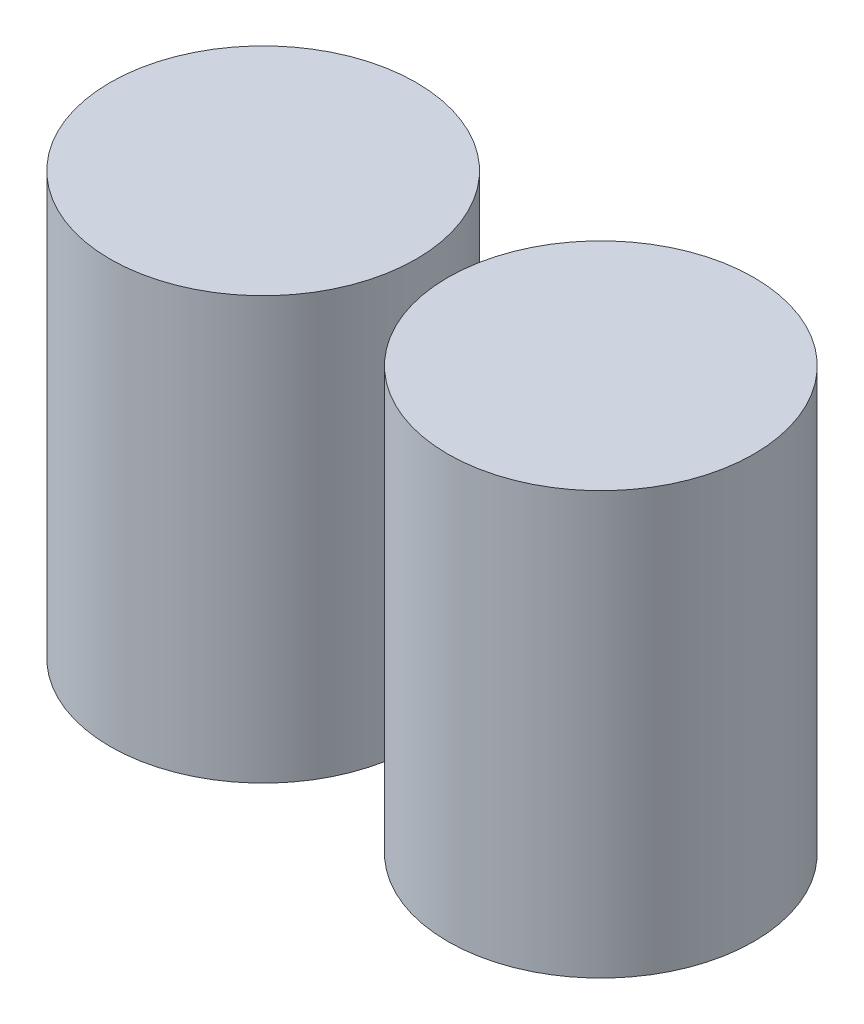
ISO-10303-21;
HEADER;
FILE_DESCRIPTION(('STEP AP214'),'2;1');
FILE_NAME('part.step','',(''),(''),'','','');
FILE_SCHEMA(('AUTOMOTIVE_DESIGN { 1 0 10303 214 1 1 1 1 }'));
ENDSEC;
DATA;
#1=APPLICATION_CONTEXT('core data for automotive mechanical design processes');
#2=APPLICATION_PROTOCOL_DEFINITION('international standard','automotive_design',2000,#1);
#3=PRODUCT_CONTEXT('',#1,'mechanical');
#4=PRODUCT('Part','Part','',(#3));
#5=PRODUCT_RELATED_PRODUCT_CATEGORY('part','',(#4));
#6=PRODUCT_DEFINITION_FORMATION('','',#4);
#7=PRODUCT_DEFINITION_CONTEXT('part definition',#1,'design');
#8=PRODUCT_DEFINITION('design','',#6,#7);
#9=PRODUCT_DEFINITION_SHAPE('','',#8);
#10=(LENGTH_UNIT() NAMED_UNIT(*) SI_UNIT(.MILLI.,.METRE.));
#11=(NAMED_UNIT(*) PLANE_ANGLE_UNIT() SI_UNIT($,.RADIAN.));
#12=(NAMED_UNIT(*) SI_UNIT($,.STERADIAN.) SOLID_ANGLE_UNIT());
#13=UNCERTAINTY_MEASURE_WITH_UNIT(LENGTH_MEASURE(1.E-05),#10,'distance_accuracy_value','');
#14=(GEOMETRIC_REPRESENTATION_CONTEXT(3) GLOBAL_UNCERTAINTY_ASSIGNED_CONTEXT((#13)) GLOBAL_UNIT_ASSIGNED_CONTEXT((#10,
#11,#12)) REPRESENTATION_CONTEXT('',''));
#15=CARTESIAN_POINT('',(0.,0.,0.));
#16=DIRECTION('',(0.,0.,1.));
#17=DIRECTION('',(1.,0.,0.));
#18=AXIS2_PLACEMENT_3D('',#15,#16,#17);
#19=CARTESIAN_POINT('',(32.,40.,0.));
#20=DIRECTION('',(0.,-1.,0.));
#21=DIRECTION('',(0.,0.,-1.));
#22=AXIS2_PLACEMENT_3D('',#19,#20,#21);
#23=CYLINDRICAL_SURFACE('',#22,14.5);
#24=CARTESIAN_POINT('',(32.,40.,0.));
#25=DIRECTION('',(0.,1.,0.));
#26=DIRECTION('',(0.,0.,1.));
#27=AXIS2_PLACEMENT_3D('',#24,#25,#26);
#28=CIRCLE('',#27,14.5);
#29=CARTESIAN_POINT('',(32.,40.,14.5));
#30=VERTEX_POINT('',#29);
#31=EDGE_CURVE('E55',#30,#30,#28,.T.);
#32=ORIENTED_EDGE('',*,*,#31,.F.);
#33=EDGE_LOOP('',(#32));
#34=FACE_BOUND('',#33,.T.);
#35=CARTESIAN_POINT('',(32.,0.,0.));
#36=DIRECTION('',(0.,1.,0.));
#37=DIRECTION('',(0.,0.,1.));
#38=AXIS2_PLACEMENT_3D('',#35,#36,#37);
#39=CIRCLE('',#38,14.5);
#40=CARTESIAN_POINT('',(32.,0.,14.5));
#41=VERTEX_POINT('',#40);
#42=EDGE_CURVE('E11',#41,#41,#39,.T.);
#43=ORIENTED_EDGE('',*,*,#42,.T.);
#44=EDGE_LOOP('',(#43));
#45=FACE_BOUND('',#44,.T.);
#46=ADVANCED_FACE('F51',(#34,#45),#23,.T.);
#47=CARTESIAN_POINT('',(32.,40.,0.));
#48=DIRECTION('',(0.,1.,0.));
#49=DIRECTION('',(0.,0.,1.));
#50=AXIS2_PLACEMENT_3D('',#47,#48,#49);
#51=PLANE('',#50);
#52=ORIENTED_EDGE('',*,*,#31,.T.);
#53=EDGE_LOOP('',(#52));
#54=FACE_BOUND('',#53,.T.);
#55=ADVANCED_FACE('F53',(#54),#51,.T.);
#56=CARTESIAN_POINT('',(32.,0.,0.));
#57=DIRECTION('',(0.,1.,0.));
#58=DIRECTION('',(0.,0.,1.));
#59=AXIS2_PLACEMENT_3D('',#56,#57,#58);
#60=PLANE('',#59);
#61=ORIENTED_EDGE('',*,*,#42,.F.);
#62=EDGE_LOOP('',(#61));
#63=FACE_BOUND('',#62,.T.);
#64=ADVANCED_FACE('F70',(#63),#60,.F.);
#65=CLOSED_SHELL('',(#46,#55,#64));
#66=MANIFOLD_SOLID_BREP('B2',#65);
#67=CARTESIAN_POINT('',(0.,40.,0.));
#68=DIRECTION('',(0.,-1.,0.));
#69=DIRECTION('',(0.,0.,-1.));
#70=AXIS2_PLACEMENT_3D('',#67,#68,#69);
#71=CYLINDRICAL_SURFACE('',#70,14.5);
#72=CARTESIAN_POINT('',(0.,40.,0.));
#73=DIRECTION('',(0.,1.,0.));
#74=DIRECTION('',(0.,0.,1.));
#75=AXIS2_PLACEMENT_3D('',#72,#73,#74);
#76=CIRCLE('',#75,14.5);
#77=CARTESIAN_POINT('',(0.,40.,14.5));
#78=VERTEX_POINT('',#77);
#79=EDGE_CURVE('E50',#78,#78,#76,.T.);
#80=ORIENTED_EDGE('',*,*,#79,.F.);
#81=EDGE_LOOP('',(#80));
#82=FACE_BOUND('',#81,.T.);
#83=CARTESIAN_POINT('',(0.,0.,0.));
#84=DIRECTION('',(0.,1.,0.));
#85=DIRECTION('',(0.,0.,1.));
#86=AXIS2_PLACEMENT_3D('',#83,#84,#85);
#87=CIRCLE('',#86,14.5);
#88=CARTESIAN_POINT('',(0.,0.,14.5));
#89=VERTEX_POINT('',#88);
#90=EDGE_CURVE('E95',#89,#89,#87,.T.);
#91=ORIENTED_EDGE('',*,*,#90,.T.);
#92=EDGE_LOOP('',(#91));
#93=FACE_BOUND('',#92,.T.);
#94=ADVANCED_FACE('F92',(#82,#93),#71,.T.);
#95=CARTESIAN_POINT('',(0.,40.,0.));
#96=DIRECTION('',(0.,1.,0.));
#97=DIRECTION('',(0.,0.,1.));
#98=AXIS2_PLACEMENT_3D('',#95,#96,#97);
#99=PLANE('',#98);
#100=ORIENTED_EDGE('',*,*,#79,.T.);
#101=EDGE_LOOP('',(#100));
#102=FACE_BOUND('',#101,.T.);
#103=ADVANCED_FACE('F109',(#102),#99,.T.);
#104=CARTESIAN_POINT('',(0.,0.,0.));
#105=DIRECTION('',(0.,1.,0.));
#106=DIRECTION('',(0.,0.,1.));
#107=AXIS2_PLACEMENT_3D('',#104,#105,#106);
#108=PLANE('',#107);
#109=ORIENTED_EDGE('',*,*,#90,.F.);
#110=EDGE_LOOP('',(#109));
#111=FACE_BOUND('',#110,.T.);
#112=ADVANCED_FACE('F107',(#111),#108,.F.);
#113=CLOSED_SHELL('',(#94,#103,#112));
#114=MANIFOLD_SOLID_BREP('B6',#113);
#115=ADVANCED_BREP_SHAPE_REPRESENTATION('',(#18,#66,#114),#14);
#116=SHAPE_DEFINITION_REPRESENTATION(#9,#115);
ENDSEC;
END-ISO-10303-21;
